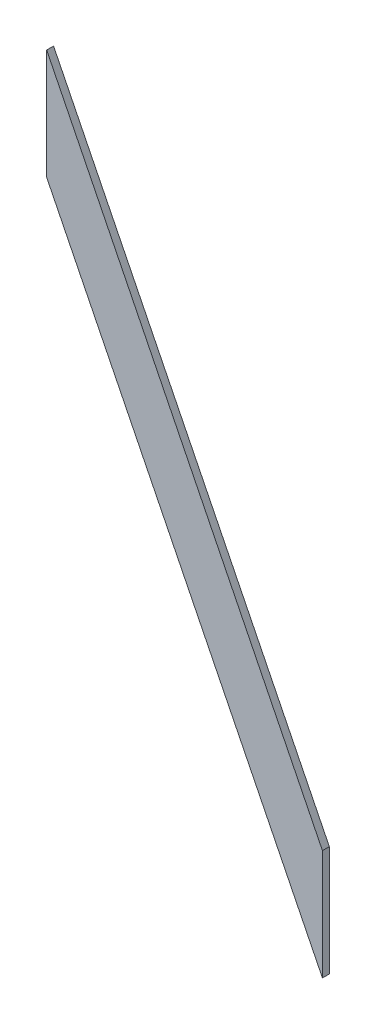
ISO-10303-21;
HEADER;
FILE_DESCRIPTION(('STEP AP214'),'2;1');
FILE_NAME('part.step','',(''),(''),'','','');
FILE_SCHEMA(('AUTOMOTIVE_DESIGN { 1 0 10303 214 1 1 1 1 }'));
ENDSEC;
DATA;
#1=APPLICATION_CONTEXT('core data for automotive mechanical design processes');
#2=APPLICATION_PROTOCOL_DEFINITION('international standard','automotive_design',2000,#1);
#3=PRODUCT_CONTEXT('',#1,'mechanical');
#4=PRODUCT('Part','Part','',(#3));
#5=PRODUCT_RELATED_PRODUCT_CATEGORY('part','',(#4));
#6=PRODUCT_DEFINITION_FORMATION('','',#4);
#7=PRODUCT_DEFINITION_CONTEXT('part definition',#1,'design');
#8=PRODUCT_DEFINITION('design','',#6,#7);
#9=PRODUCT_DEFINITION_SHAPE('','',#8);
#10=(LENGTH_UNIT() NAMED_UNIT(*) SI_UNIT(.MILLI.,.METRE.));
#11=(NAMED_UNIT(*) PLANE_ANGLE_UNIT() SI_UNIT($,.RADIAN.));
#12=(NAMED_UNIT(*) SI_UNIT($,.STERADIAN.) SOLID_ANGLE_UNIT());
#13=UNCERTAINTY_MEASURE_WITH_UNIT(LENGTH_MEASURE(1.E-05),#10,'distance_accuracy_value','');
#14=(GEOMETRIC_REPRESENTATION_CONTEXT(3) GLOBAL_UNCERTAINTY_ASSIGNED_CONTEXT((#13)) GLOBAL_UNIT_ASSIGNED_CONTEXT((#10,
#11,#12)) REPRESENTATION_CONTEXT('',''));
#15=CARTESIAN_POINT('',(0.,0.,0.));
#16=DIRECTION('',(0.,0.,1.));
#17=DIRECTION('',(1.,0.,0.));
#18=AXIS2_PLACEMENT_3D('',#15,#16,#17);
#19=CARTESIAN_POINT('',(0.,-25.4,3.175));
#20=DIRECTION('',(0.895694807099303,0.444669329429569,0.));
#21=DIRECTION('',(-0.444669329429569,0.895694807099303,0.));
#22=AXIS2_PLACEMENT_3D('',#19,#20,#21);
#23=PLANE('',#22);
#24=DIRECTION('',(0.444669329429569,-0.895694807099303,0.));
#25=VECTOR('',#24,1.);
#26=CARTESIAN_POINT('',(0.,-25.4,0.));
#27=LINE('',#26,#25);
#28=CARTESIAN_POINT('',(0.,-25.4,0.));
#29=VERTEX_POINT('',#28);
#30=CARTESIAN_POINT('',(127.,-281.215350808063,0.));
#31=VERTEX_POINT('',#30);
#32=EDGE_CURVE('E96',#29,#31,#27,.T.);
#33=ORIENTED_EDGE('',*,*,#32,.T.);
#34=DIRECTION('',(0.,0.,-1.));
#35=VECTOR('',#34,1.);
#36=CARTESIAN_POINT('',(127.,-281.215350808063,3.175));
#37=LINE('',#36,#35);
#38=CARTESIAN_POINT('',(127.,-281.215350808063,3.175));
#39=VERTEX_POINT('',#38);
#40=EDGE_CURVE('E11',#39,#31,#37,.T.);
#41=ORIENTED_EDGE('',*,*,#40,.F.);
#42=DIRECTION('',(0.444669329429569,-0.895694807099303,0.));
#43=VECTOR('',#42,1.);
#44=CARTESIAN_POINT('',(0.,-25.4,3.175));
#45=LINE('',#44,#43);
#46=CARTESIAN_POINT('',(0.,-25.4,3.175));
#47=VERTEX_POINT('',#46);
#48=EDGE_CURVE('E84',#47,#39,#45,.T.);
#49=ORIENTED_EDGE('',*,*,#48,.F.);
#50=DIRECTION('',(0.,0.,-1.));
#51=VECTOR('',#50,1.);
#52=CARTESIAN_POINT('',(0.,-25.4,3.175));
#53=LINE('',#52,#51);
#54=EDGE_CURVE('E92',#47,#29,#53,.T.);
#55=ORIENTED_EDGE('',*,*,#54,.T.);
#56=EDGE_LOOP('',(#33,#41,#49,#55));
#57=FACE_BOUND('',#56,.T.);
#58=ADVANCED_FACE('F33',(#57),#23,.F.);
#59=CARTESIAN_POINT('',(127.,-281.215350808063,3.175));
#60=DIRECTION('',(-1.,0.,0.));
#61=DIRECTION('',(0.,-1.,0.));
#62=AXIS2_PLACEMENT_3D('',#59,#60,#61);
#63=PLANE('',#62);
#64=DIRECTION('',(0.,1.,0.));
#65=VECTOR('',#64,1.);
#66=CARTESIAN_POINT('',(127.,-281.215350808063,0.));
#67=LINE('',#66,#65);
#68=CARTESIAN_POINT('',(127.,-230.415350808063,0.));
#69=VERTEX_POINT('',#68);
#70=EDGE_CURVE('E88',#31,#69,#67,.T.);
#71=ORIENTED_EDGE('',*,*,#70,.T.);
#72=DIRECTION('',(0.,0.,-1.));
#73=VECTOR('',#72,1.);
#74=CARTESIAN_POINT('',(127.,-230.415350808063,3.175));
#75=LINE('',#74,#73);
#76=CARTESIAN_POINT('',(127.,-230.415350808063,3.175));
#77=VERTEX_POINT('',#76);
#78=EDGE_CURVE('E41',#77,#69,#75,.T.);
#79=ORIENTED_EDGE('',*,*,#78,.F.);
#80=DIRECTION('',(0.,1.,0.));
#81=VECTOR('',#80,1.);
#82=CARTESIAN_POINT('',(127.,-281.215350808063,3.175));
#83=LINE('',#82,#81);
#84=EDGE_CURVE('E79',#39,#77,#83,.T.);
#85=ORIENTED_EDGE('',*,*,#84,.F.);
#86=ORIENTED_EDGE('',*,*,#40,.T.);
#87=EDGE_LOOP('',(#71,#79,#85,#86));
#88=FACE_BOUND('',#87,.T.);
#89=ADVANCED_FACE('F87',(#88),#63,.F.);
#90=CARTESIAN_POINT('',(0.,25.4,3.175));
#91=DIRECTION('',(-0.895694807099303,-0.444669329429569,0.));
#92=DIRECTION('',(0.444669329429569,-0.895694807099303,0.));
#93=AXIS2_PLACEMENT_3D('',#90,#91,#92);
#94=PLANE('',#93);
#95=DIRECTION('',(-0.444669329429569,0.895694807099303,0.));
#96=VECTOR('',#95,1.);
#97=CARTESIAN_POINT('',(0.,25.4,0.));
#98=LINE('',#97,#96);
#99=CARTESIAN_POINT('',(0.,25.4,0.));
#100=VERTEX_POINT('',#99);
#101=EDGE_CURVE('E66',#69,#100,#98,.T.);
#102=ORIENTED_EDGE('',*,*,#101,.T.);
#103=DIRECTION('',(0.,0.,-1.));
#104=VECTOR('',#103,1.);
#105=CARTESIAN_POINT('',(0.,25.4,3.175));
#106=LINE('',#105,#104);
#107=CARTESIAN_POINT('',(0.,25.4,3.175));
#108=VERTEX_POINT('',#107);
#109=EDGE_CURVE('E89',#108,#100,#106,.T.);
#110=ORIENTED_EDGE('',*,*,#109,.F.);
#111=DIRECTION('',(-0.444669329429569,0.895694807099303,0.));
#112=VECTOR('',#111,1.);
#113=CARTESIAN_POINT('',(0.,25.4,3.175));
#114=LINE('',#113,#112);
#115=EDGE_CURVE('E82',#77,#108,#114,.T.);
#116=ORIENTED_EDGE('',*,*,#115,.F.);
#117=ORIENTED_EDGE('',*,*,#78,.T.);
#118=EDGE_LOOP('',(#102,#110,#116,#117));
#119=FACE_BOUND('',#118,.T.);
#120=ADVANCED_FACE('F90',(#119),#94,.F.);
#121=CARTESIAN_POINT('',(0.,-25.4,3.175));
#122=DIRECTION('',(1.,0.,0.));
#123=DIRECTION('',(0.,0.,-1.));
#124=AXIS2_PLACEMENT_3D('',#121,#122,#123);
#125=PLANE('',#124);
#126=DIRECTION('',(0.,-1.,0.));
#127=VECTOR('',#126,1.);
#128=CARTESIAN_POINT('',(0.,-25.4,0.));
#129=LINE('',#128,#127);
#130=EDGE_CURVE('E72',#100,#29,#129,.T.);
#131=ORIENTED_EDGE('',*,*,#130,.T.);
#132=ORIENTED_EDGE('',*,*,#54,.F.);
#133=DIRECTION('',(0.,-1.,0.));
#134=VECTOR('',#133,1.);
#135=CARTESIAN_POINT('',(0.,-25.4,3.175));
#136=LINE('',#135,#134);
#137=EDGE_CURVE('E49',#108,#47,#136,.T.);
#138=ORIENTED_EDGE('',*,*,#137,.F.);
#139=ORIENTED_EDGE('',*,*,#109,.T.);
#140=EDGE_LOOP('',(#131,#132,#138,#139));
#141=FACE_BOUND('',#140,.T.);
#142=ADVANCED_FACE('F103',(#141),#125,.F.);
#143=CARTESIAN_POINT('',(127.,-281.215350808064,3.175));
#144=DIRECTION('',(0.,0.,1.));
#145=DIRECTION('',(1.,0.,0.));
#146=AXIS2_PLACEMENT_3D('',#143,#144,#145);
#147=PLANE('',#146);
#148=ORIENTED_EDGE('',*,*,#48,.T.);
#149=ORIENTED_EDGE('',*,*,#84,.T.);
#150=ORIENTED_EDGE('',*,*,#115,.T.);
#151=ORIENTED_EDGE('',*,*,#137,.T.);
#152=EDGE_LOOP('',(#148,#149,#150,#151));
#153=FACE_BOUND('',#152,.T.);
#154=ADVANCED_FACE('F80',(#153),#147,.T.);
#155=CARTESIAN_POINT('',(127.,-281.215350808064,0.));
#156=DIRECTION('',(0.,0.,1.));
#157=DIRECTION('',(1.,0.,0.));
#158=AXIS2_PLACEMENT_3D('',#155,#156,#157);
#159=PLANE('',#158);
#160=ORIENTED_EDGE('',*,*,#32,.F.);
#161=ORIENTED_EDGE('',*,*,#130,.F.);
#162=ORIENTED_EDGE('',*,*,#101,.F.);
#163=ORIENTED_EDGE('',*,*,#70,.F.);
#164=EDGE_LOOP('',(#160,#161,#162,#163));
#165=FACE_BOUND('',#164,.T.);
#166=ADVANCED_FACE('F106',(#165),#159,.F.);
#167=CLOSED_SHELL('',(#58,#89,#120,#142,#154,#166));
#168=MANIFOLD_SOLID_BREP('B2',#167);
#169=ADVANCED_BREP_SHAPE_REPRESENTATION('',(#18,#168),#14);
#170=SHAPE_DEFINITION_REPRESENTATION(#9,#169);
ENDSEC;
END-ISO-10303-21;
